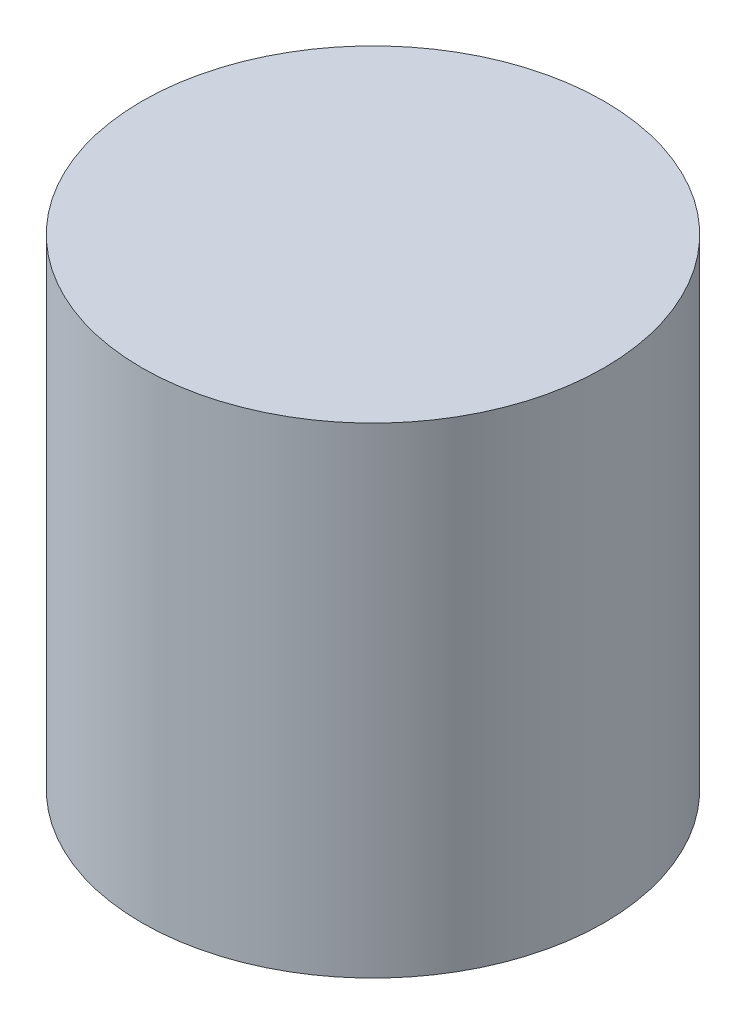
ISO-10303-21;
HEADER;
FILE_DESCRIPTION(('STEP AP214'),'2;1');
FILE_NAME('part.step','',(''),(''),'','','');
FILE_SCHEMA(('AUTOMOTIVE_DESIGN { 1 0 10303 214 1 1 1 1 }'));
ENDSEC;
DATA;
#1=APPLICATION_CONTEXT('core data for automotive mechanical design processes');
#2=APPLICATION_PROTOCOL_DEFINITION('international standard','automotive_design',2000,#1);
#3=PRODUCT_CONTEXT('',#1,'mechanical');
#4=PRODUCT('Part','Part','',(#3));
#5=PRODUCT_RELATED_PRODUCT_CATEGORY('part','',(#4));
#6=PRODUCT_DEFINITION_FORMATION('','',#4);
#7=PRODUCT_DEFINITION_CONTEXT('part definition',#1,'design');
#8=PRODUCT_DEFINITION('design','',#6,#7);
#9=PRODUCT_DEFINITION_SHAPE('','',#8);
#10=(LENGTH_UNIT() NAMED_UNIT(*) SI_UNIT(.MILLI.,.METRE.));
#11=(NAMED_UNIT(*) PLANE_ANGLE_UNIT() SI_UNIT($,.RADIAN.));
#12=(NAMED_UNIT(*) SI_UNIT($,.STERADIAN.) SOLID_ANGLE_UNIT());
#13=UNCERTAINTY_MEASURE_WITH_UNIT(LENGTH_MEASURE(1.E-05),#10,'distance_accuracy_value','');
#14=(GEOMETRIC_REPRESENTATION_CONTEXT(3) GLOBAL_UNCERTAINTY_ASSIGNED_CONTEXT((#13)) GLOBAL_UNIT_ASSIGNED_CONTEXT((#10,
#11,#12)) REPRESENTATION_CONTEXT('',''));
#15=CARTESIAN_POINT('',(0.,0.,0.));
#16=DIRECTION('',(0.,0.,1.));
#17=DIRECTION('',(1.,0.,0.));
#18=AXIS2_PLACEMENT_3D('',#15,#16,#17);
#19=CARTESIAN_POINT('',(0.,51.8,0.));
#20=DIRECTION('',(0.,-1.,0.));
#21=DIRECTION('',(0.,0.,-1.));
#22=AXIS2_PLACEMENT_3D('',#19,#20,#21);
#23=CYLINDRICAL_SURFACE('',#22,24.9);
#24=CARTESIAN_POINT('',(0.,51.8,0.));
#25=DIRECTION('',(0.,1.,0.));
#26=DIRECTION('',(0.,0.,1.));
#27=AXIS2_PLACEMENT_3D('',#24,#25,#26);
#28=CIRCLE('',#27,24.9);
#29=CARTESIAN_POINT('',(0.,51.8,-24.9));
#30=VERTEX_POINT('',#29);
#31=EDGE_CURVE('E10',#30,#30,#28,.T.);
#32=CARTESIAN_POINT('',(0.,0.,0.));
#33=DIRECTION('',(0.,1.,0.));
#34=DIRECTION('',(0.,0.,1.));
#35=AXIS2_PLACEMENT_3D('',#32,#33,#34);
#36=CIRCLE('',#35,24.9);
#37=CARTESIAN_POINT('',(0.,0.,-24.9));
#38=VERTEX_POINT('',#37);
#39=EDGE_CURVE('E40',#38,#38,#36,.T.);
#40=CARTESIAN_POINT('',(0.,51.8,-24.9));
#41=CARTESIAN_POINT('',(0.,51.2604166666667,-24.9));
#42=CARTESIAN_POINT('',(0.,50.7208333333333,-24.9));
#43=CARTESIAN_POINT('',(0.,49.6416666666667,-24.9));
#44=CARTESIAN_POINT('',(0.,49.1020833333333,-24.9));
#45=CARTESIAN_POINT('',(0.,48.0229166666667,-24.9));
#46=CARTESIAN_POINT('',(0.,47.4833333333333,-24.9));
#47=CARTESIAN_POINT('',(0.,46.4041666666667,-24.9));
#48=CARTESIAN_POINT('',(0.,45.8645833333333,-24.9));
#49=CARTESIAN_POINT('',(0.,44.7854166666667,-24.9));
#50=CARTESIAN_POINT('',(0.,44.2458333333333,-24.9));
#51=CARTESIAN_POINT('',(0.,43.1666666666667,-24.9));
#52=CARTESIAN_POINT('',(0.,42.6270833333333,-24.9));
#53=CARTESIAN_POINT('',(0.,41.5479166666667,-24.9));
#54=CARTESIAN_POINT('',(0.,41.0083333333333,-24.9));
#55=CARTESIAN_POINT('',(0.,39.9291666666667,-24.9));
#56=CARTESIAN_POINT('',(0.,39.3895833333333,-24.9));
#57=CARTESIAN_POINT('',(0.,38.3104166666667,-24.9));
#58=CARTESIAN_POINT('',(0.,37.7708333333333,-24.9));
#59=CARTESIAN_POINT('',(0.,36.6916666666667,-24.9));
#60=CARTESIAN_POINT('',(0.,36.1520833333333,-24.9));
#61=CARTESIAN_POINT('',(0.,35.0729166666667,-24.9));
#62=CARTESIAN_POINT('',(0.,34.5333333333333,-24.9));
#63=CARTESIAN_POINT('',(0.,33.4541666666667,-24.9));
#64=CARTESIAN_POINT('',(0.,32.9145833333333,-24.9));
#65=CARTESIAN_POINT('',(0.,31.8354166666667,-24.9));
#66=CARTESIAN_POINT('',(0.,31.2958333333333,-24.9));
#67=CARTESIAN_POINT('',(0.,30.2166666666667,-24.9));
#68=CARTESIAN_POINT('',(0.,29.6770833333333,-24.9));
#69=CARTESIAN_POINT('',(0.,28.5979166666667,-24.9));
#70=CARTESIAN_POINT('',(0.,28.0583333333333,-24.9));
#71=CARTESIAN_POINT('',(0.,26.9791666666667,-24.9));
#72=CARTESIAN_POINT('',(0.,26.4395833333333,-24.9));
#73=CARTESIAN_POINT('',(0.,25.3604166666667,-24.9));
#74=CARTESIAN_POINT('',(0.,24.8208333333333,-24.9));
#75=CARTESIAN_POINT('',(0.,23.7416666666667,-24.9));
#76=CARTESIAN_POINT('',(0.,23.2020833333333,-24.9));
#77=CARTESIAN_POINT('',(0.,22.1229166666667,-24.9));
#78=CARTESIAN_POINT('',(0.,21.5833333333333,-24.9));
#79=CARTESIAN_POINT('',(0.,20.5041666666667,-24.9));
#80=CARTESIAN_POINT('',(0.,19.9645833333333,-24.9));
#81=CARTESIAN_POINT('',(0.,18.8854166666667,-24.9));
#82=CARTESIAN_POINT('',(0.,18.3458333333333,-24.9));
#83=CARTESIAN_POINT('',(0.,17.2666666666667,-24.9));
#84=CARTESIAN_POINT('',(0.,16.7270833333333,-24.9));
#85=CARTESIAN_POINT('',(0.,15.6479166666667,-24.9));
#86=CARTESIAN_POINT('',(0.,15.1083333333333,-24.9));
#87=CARTESIAN_POINT('',(0.,14.0291666666667,-24.9));
#88=CARTESIAN_POINT('',(0.,13.4895833333333,-24.9));
#89=CARTESIAN_POINT('',(0.,12.4104166666667,-24.9));
#90=CARTESIAN_POINT('',(0.,11.8708333333333,-24.9));
#91=CARTESIAN_POINT('',(0.,10.7916666666667,-24.9));
#92=CARTESIAN_POINT('',(0.,10.2520833333333,-24.9));
#93=CARTESIAN_POINT('',(0.,9.17291666666666,-24.9));
#94=CARTESIAN_POINT('',(0.,8.63333333333333,-24.9));
#95=CARTESIAN_POINT('',(0.,7.55416666666666,-24.9));
#96=CARTESIAN_POINT('',(0.,7.01458333333333,-24.9));
#97=CARTESIAN_POINT('',(0.,5.93541666666666,-24.9));
#98=CARTESIAN_POINT('',(0.,5.39583333333333,-24.9));
#99=CARTESIAN_POINT('',(0.,4.31666666666666,-24.9));
#100=CARTESIAN_POINT('',(0.,3.77708333333333,-24.9));
#101=CARTESIAN_POINT('',(0.,2.69791666666666,-24.9));
#102=CARTESIAN_POINT('',(0.,2.15833333333333,-24.9));
#103=CARTESIAN_POINT('',(0.,1.07916666666666,-24.9));
#104=CARTESIAN_POINT('',(0.,0.539583333333327,-24.9));
#105=CARTESIAN_POINT('',(0.,0.,-24.9));
#106=B_SPLINE_CURVE_WITH_KNOTS('',3,(#40,#41,#42,#43,#44,#45,#46,#47,#48,#49,#50,#51,#52,#53,
#54,#55,#56,#57,#58,#59,#60,#61,#62,#63,#64,#65,#66,#67,#68,#69,#70,#71,#72,#73,#74,#75,#76,#77,
#78,#79,#80,#81,#82,#83,#84,#85,#86,#87,#88,#89,#90,#91,#92,#93,#94,#95,#96,#97,#98,#99,#100,
#101,#102,#103,#104,#105),.UNSPECIFIED.,.F.,.F.,(4,2,2,2,2,2,2,2,2,2,2,2,2,2,2,2,2,2,2,2,2,2,2,
2,2,2,2,2,2,2,2,2,4),(0.,1.61875,3.2375,4.85625000000001,6.475,8.09375,9.71250000000001,
11.33125,12.95,14.56875,16.1875,17.80625,19.425,21.04375,22.6625,24.28125,25.9,27.51875,29.1375,
30.75625,32.375,33.99375,35.6125,37.23125,38.85,40.46875,42.0875,43.70625,45.325,46.94375,
48.5625,50.18125,51.8),.UNSPECIFIED.);
#107=EDGE_CURVE('BSEAM37',#30,#38,#106,.T.);
#108=ORIENTED_EDGE('',*,*,#31,.F.);
#109=ORIENTED_EDGE('',*,*,#39,.T.);
#110=ORIENTED_EDGE('',*,*,#107,.T.);
#111=ORIENTED_EDGE('',*,*,#107,.F.);
#112=EDGE_LOOP('',(#108,#110,#109,#111));
#113=FACE_BOUND('',#112,.T.);
#114=ADVANCED_FACE('F37',(#113),#23,.T.);
#115=CARTESIAN_POINT('',(0.,51.8,0.));
#116=DIRECTION('',(0.,1.,0.));
#117=DIRECTION('',(0.,0.,1.));
#118=AXIS2_PLACEMENT_3D('',#115,#116,#117);
#119=PLANE('',#118);
#120=ORIENTED_EDGE('',*,*,#31,.T.);
#121=EDGE_LOOP('',(#120));
#122=FACE_BOUND('',#121,.T.);
#123=ADVANCED_FACE('F54',(#122),#119,.T.);
#124=CARTESIAN_POINT('',(0.,0.,0.));
#125=DIRECTION('',(0.,1.,0.));
#126=DIRECTION('',(0.,0.,1.));
#127=AXIS2_PLACEMENT_3D('',#124,#125,#126);
#128=PLANE('',#127);
#129=ORIENTED_EDGE('',*,*,#39,.F.);
#130=EDGE_LOOP('',(#129));
#131=FACE_BOUND('',#130,.T.);
#132=ADVANCED_FACE('F52',(#131),#128,.F.);
#133=CLOSED_SHELL('',(#114,#123,#132));
#134=MANIFOLD_SOLID_BREP('B2',#133);
#135=ADVANCED_BREP_SHAPE_REPRESENTATION('',(#18,#134),#14);
#136=SHAPE_DEFINITION_REPRESENTATION(#9,#135);
ENDSEC;
END-ISO-10303-21;
